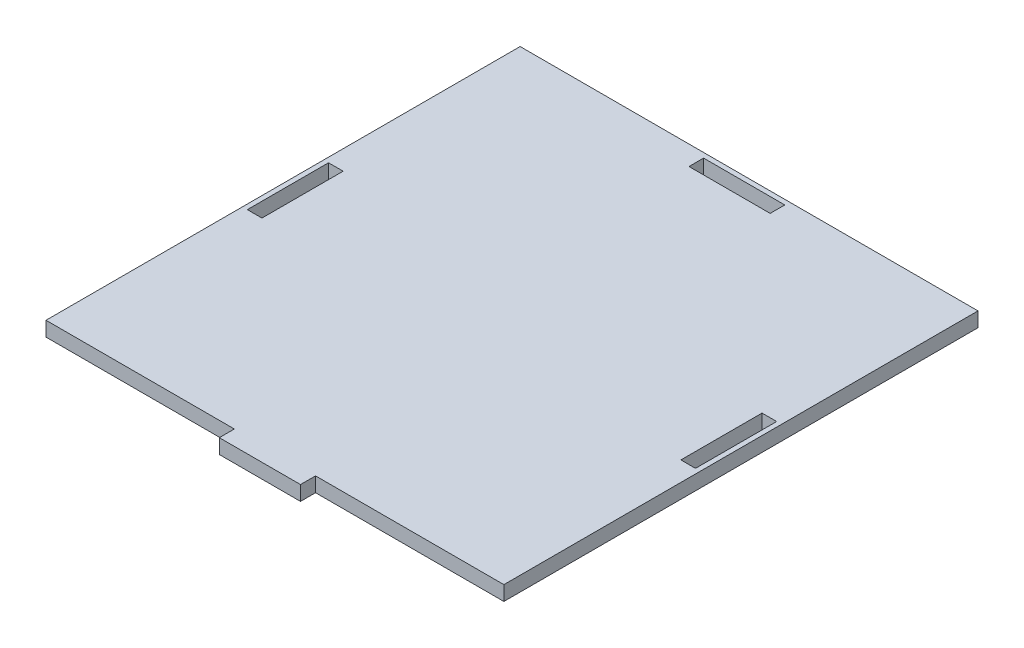
ISO-10303-21;
HEADER;
FILE_DESCRIPTION(('STEP AP214'),'2;1');
FILE_NAME('part.step','',(''),(''),'','','');
FILE_SCHEMA(('AUTOMOTIVE_DESIGN { 1 0 10303 214 1 1 1 1 }'));
ENDSEC;
DATA;
#1=APPLICATION_CONTEXT('core data for automotive mechanical design processes');
#2=APPLICATION_PROTOCOL_DEFINITION('international standard','automotive_design',2000,#1);
#3=PRODUCT_CONTEXT('',#1,'mechanical');
#4=PRODUCT('Part','Part','',(#3));
#5=PRODUCT_RELATED_PRODUCT_CATEGORY('part','',(#4));
#6=PRODUCT_DEFINITION_FORMATION('','',#4);
#7=PRODUCT_DEFINITION_CONTEXT('part definition',#1,'design');
#8=PRODUCT_DEFINITION('design','',#6,#7);
#9=PRODUCT_DEFINITION_SHAPE('','',#8);
#10=(LENGTH_UNIT() NAMED_UNIT(*) SI_UNIT(.MILLI.,.METRE.));
#11=(NAMED_UNIT(*) PLANE_ANGLE_UNIT() SI_UNIT($,.RADIAN.));
#12=(NAMED_UNIT(*) SI_UNIT($,.STERADIAN.) SOLID_ANGLE_UNIT());
#13=UNCERTAINTY_MEASURE_WITH_UNIT(LENGTH_MEASURE(1.E-05),#10,'distance_accuracy_value','');
#14=(GEOMETRIC_REPRESENTATION_CONTEXT(3) GLOBAL_UNCERTAINTY_ASSIGNED_CONTEXT((#13)) GLOBAL_UNIT_ASSIGNED_CONTEXT((#10,
#11,#12)) REPRESENTATION_CONTEXT('',''));
#15=CARTESIAN_POINT('',(0.,0.,0.));
#16=DIRECTION('',(0.,0.,1.));
#17=DIRECTION('',(1.,0.,0.));
#18=AXIS2_PLACEMENT_3D('',#15,#16,#17);
#19=CARTESIAN_POINT('',(0.,18.,0.));
#20=DIRECTION('',(0.,1.,0.));
#21=DIRECTION('',(0.,0.,1.));
#22=AXIS2_PLACEMENT_3D('',#19,#20,#21);
#23=PLANE('',#22);
#24=DIRECTION('',(1.,0.,0.));
#25=VECTOR('',#24,1.);
#26=CARTESIAN_POINT('',(-50.0000000000003,18.,-286.));
#27=LINE('',#26,#25);
#28=CARTESIAN_POINT('',(-50.0000000000003,18.,-286.));
#29=VERTEX_POINT('',#28);
#30=CARTESIAN_POINT('',(49.9999999999998,18.,-286.));
#31=VERTEX_POINT('',#30);
#32=EDGE_CURVE('E177',#29,#31,#27,.T.);
#33=ORIENTED_EDGE('',*,*,#32,.T.);
#34=DIRECTION('',(0.,0.,-1.));
#35=VECTOR('',#34,1.);
#36=CARTESIAN_POINT('',(49.9999999999998,18.,-268.));
#37=LINE('',#36,#35);
#38=CARTESIAN_POINT('',(49.9999999999998,18.,-268.));
#39=VERTEX_POINT('',#38);
#40=EDGE_CURVE('E169',#39,#31,#37,.T.);
#41=ORIENTED_EDGE('',*,*,#40,.F.);
#42=DIRECTION('',(1.,0.,0.));
#43=VECTOR('',#42,1.);
#44=CARTESIAN_POINT('',(-50.0000000000003,18.,-268.));
#45=LINE('',#44,#43);
#46=CARTESIAN_POINT('',(-50.0000000000003,18.,-268.));
#47=VERTEX_POINT('',#46);
#48=EDGE_CURVE('E176',#47,#39,#45,.T.);
#49=ORIENTED_EDGE('',*,*,#48,.F.);
#50=DIRECTION('',(0.,0.,-1.));
#51=VECTOR('',#50,1.);
#52=CARTESIAN_POINT('',(-50.0000000000003,18.,-268.));
#53=LINE('',#52,#51);
#54=EDGE_CURVE('E182',#47,#29,#53,.T.);
#55=ORIENTED_EDGE('',*,*,#54,.T.);
#56=EDGE_LOOP('',(#33,#41,#49,#55));
#57=FACE_BOUND('',#56,.T.);
#58=DIRECTION('',(-1.,0.,0.));
#59=VECTOR('',#58,1.);
#60=CARTESIAN_POINT('',(-258.,18.,50.));
#61=LINE('',#60,#59);
#62=CARTESIAN_POINT('',(-258.,18.,50.));
#63=VERTEX_POINT('',#62);
#64=CARTESIAN_POINT('',(-276.,18.,50.));
#65=VERTEX_POINT('',#64);
#66=EDGE_CURVE('E251',#63,#65,#61,.T.);
#67=ORIENTED_EDGE('',*,*,#66,.T.);
#68=DIRECTION('',(0.,0.,-1.));
#69=VECTOR('',#68,1.);
#70=CARTESIAN_POINT('',(-276.,18.,50.));
#71=LINE('',#70,#69);
#72=CARTESIAN_POINT('',(-276.,18.,-50.0000000000001));
#73=VERTEX_POINT('',#72);
#74=EDGE_CURVE('E262',#65,#73,#71,.T.);
#75=ORIENTED_EDGE('',*,*,#74,.T.);
#76=DIRECTION('',(-1.,0.,0.));
#77=VECTOR('',#76,1.);
#78=CARTESIAN_POINT('',(-258.,18.,-50.0000000000001));
#79=LINE('',#78,#77);
#80=CARTESIAN_POINT('',(-258.,18.,-50.0000000000001));
#81=VERTEX_POINT('',#80);
#82=EDGE_CURVE('E259',#81,#73,#79,.T.);
#83=ORIENTED_EDGE('',*,*,#82,.F.);
#84=DIRECTION('',(0.,0.,-1.));
#85=VECTOR('',#84,1.);
#86=CARTESIAN_POINT('',(-258.,18.,50.));
#87=LINE('',#86,#85);
#88=EDGE_CURVE('E241',#63,#81,#87,.T.);
#89=ORIENTED_EDGE('',*,*,#88,.F.);
#90=EDGE_LOOP('',(#67,#75,#83,#89));
#91=FACE_BOUND('',#90,.T.);
#92=DIRECTION('',(0.,0.,1.));
#93=VECTOR('',#92,1.);
#94=CARTESIAN_POINT('',(-282.,18.,-292.));
#95=LINE('',#94,#93);
#96=CARTESIAN_POINT('',(-282.,18.,-292.));
#97=VERTEX_POINT('',#96);
#98=CARTESIAN_POINT('',(-282.,18.,292.));
#99=VERTEX_POINT('',#98);
#100=EDGE_CURVE('E267',#97,#99,#95,.T.);
#101=ORIENTED_EDGE('',*,*,#100,.T.);
#102=DIRECTION('',(1.,0.,0.));
#103=VECTOR('',#102,1.);
#104=CARTESIAN_POINT('',(-282.,18.,292.));
#105=LINE('',#104,#103);
#106=CARTESIAN_POINT('',(-50.0000000000001,18.,292.));
#107=VERTEX_POINT('',#106);
#108=EDGE_CURVE('E270',#99,#107,#105,.T.);
#109=ORIENTED_EDGE('',*,*,#108,.T.);
#110=DIRECTION('',(0.,0.,1.));
#111=VECTOR('',#110,1.);
#112=CARTESIAN_POINT('',(-50.0000000000001,18.,292.));
#113=LINE('',#112,#111);
#114=CARTESIAN_POINT('',(-50.0000000000001,18.,310.51797990373));
#115=VERTEX_POINT('',#114);
#116=EDGE_CURVE('E273',#107,#115,#113,.T.);
#117=ORIENTED_EDGE('',*,*,#116,.T.);
#118=DIRECTION('',(1.,0.,0.));
#119=VECTOR('',#118,1.);
#120=CARTESIAN_POINT('',(-50.0000000000001,18.,310.51797990373));
#121=LINE('',#120,#119);
#122=CARTESIAN_POINT('',(49.9999999999999,18.,310.51797990373));
#123=VERTEX_POINT('',#122);
#124=EDGE_CURVE('E275',#115,#123,#121,.T.);
#125=ORIENTED_EDGE('',*,*,#124,.T.);
#126=DIRECTION('',(0.,0.,-1.));
#127=VECTOR('',#126,1.);
#128=CARTESIAN_POINT('',(49.9999999999999,18.,310.51797990373));
#129=LINE('',#128,#127);
#130=CARTESIAN_POINT('',(49.9999999999999,18.,292.));
#131=VERTEX_POINT('',#130);
#132=EDGE_CURVE('E277',#123,#131,#129,.T.);
#133=ORIENTED_EDGE('',*,*,#132,.T.);
#134=DIRECTION('',(1.,0.,0.));
#135=VECTOR('',#134,1.);
#136=CARTESIAN_POINT('',(49.9999999999999,18.,292.));
#137=LINE('',#136,#135);
#138=CARTESIAN_POINT('',(282.,18.,292.));
#139=VERTEX_POINT('',#138);
#140=EDGE_CURVE('E279',#131,#139,#137,.T.);
#141=ORIENTED_EDGE('',*,*,#140,.T.);
#142=DIRECTION('',(0.,0.,1.));
#143=VECTOR('',#142,1.);
#144=CARTESIAN_POINT('',(282.,18.,-292.));
#145=LINE('',#144,#143);
#146=CARTESIAN_POINT('',(282.,18.,-292.));
#147=VERTEX_POINT('',#146);
#148=EDGE_CURVE('E281',#147,#139,#145,.T.);
#149=ORIENTED_EDGE('',*,*,#148,.F.);
#150=DIRECTION('',(1.,0.,0.));
#151=VECTOR('',#150,1.);
#152=CARTESIAN_POINT('',(-282.,18.,-292.));
#153=LINE('',#152,#151);
#154=EDGE_CURVE('E284',#97,#147,#153,.T.);
#155=ORIENTED_EDGE('',*,*,#154,.F.);
#156=EDGE_LOOP('',(#101,#109,#117,#125,#133,#141,#149,#155));
#157=FACE_BOUND('',#156,.T.);
#158=DIRECTION('',(1.,0.,0.));
#159=VECTOR('',#158,1.);
#160=CARTESIAN_POINT('',(0.,18.,-50.0000000000001));
#161=LINE('',#160,#159);
#162=CARTESIAN_POINT('',(258.,18.,-50.0000000000001));
#163=VERTEX_POINT('',#162);
#164=CARTESIAN_POINT('',(276.,18.,-50.0000000000001));
#165=VERTEX_POINT('',#164);
#166=EDGE_CURVE('E213',#163,#165,#161,.T.);
#167=ORIENTED_EDGE('',*,*,#166,.T.);
#168=DIRECTION('',(0.,0.,-1.));
#169=VECTOR('',#168,1.);
#170=CARTESIAN_POINT('',(276.,18.,0.));
#171=LINE('',#170,#169);
#172=CARTESIAN_POINT('',(276.,18.,50.));
#173=VERTEX_POINT('',#172);
#174=EDGE_CURVE('E205',#173,#165,#171,.T.);
#175=ORIENTED_EDGE('',*,*,#174,.F.);
#176=DIRECTION('',(1.,0.,0.));
#177=VECTOR('',#176,1.);
#178=CARTESIAN_POINT('',(0.,18.,50.));
#179=LINE('',#178,#177);
#180=CARTESIAN_POINT('',(258.,18.,50.));
#181=VERTEX_POINT('',#180);
#182=EDGE_CURVE('E207',#181,#173,#179,.T.);
#183=ORIENTED_EDGE('',*,*,#182,.F.);
#184=DIRECTION('',(0.,0.,-1.));
#185=VECTOR('',#184,1.);
#186=CARTESIAN_POINT('',(258.,18.,0.));
#187=LINE('',#186,#185);
#188=EDGE_CURVE('E210',#181,#163,#187,.T.);
#189=ORIENTED_EDGE('',*,*,#188,.T.);
#190=EDGE_LOOP('',(#167,#175,#183,#189));
#191=FACE_BOUND('',#190,.T.);
#192=ADVANCED_FACE('F33',(#57,#91,#157,#191),#23,.T.);
#193=CARTESIAN_POINT('',(0.,0.,0.));
#194=DIRECTION('',(0.,1.,0.));
#195=DIRECTION('',(0.,0.,1.));
#196=AXIS2_PLACEMENT_3D('',#193,#194,#195);
#197=PLANE('',#196);
#198=DIRECTION('',(0.,0.,-1.));
#199=VECTOR('',#198,1.);
#200=CARTESIAN_POINT('',(49.9999999999998,0.,-268.));
#201=LINE('',#200,#199);
#202=CARTESIAN_POINT('',(49.9999999999998,0.,-268.));
#203=VERTEX_POINT('',#202);
#204=CARTESIAN_POINT('',(49.9999999999998,0.,-286.));
#205=VERTEX_POINT('',#204);
#206=EDGE_CURVE('E195',#203,#205,#201,.T.);
#207=ORIENTED_EDGE('',*,*,#206,.T.);
#208=DIRECTION('',(1.,0.,0.));
#209=VECTOR('',#208,1.);
#210=CARTESIAN_POINT('',(-50.0000000000003,0.,-286.));
#211=LINE('',#210,#209);
#212=CARTESIAN_POINT('',(-50.0000000000003,0.,-286.));
#213=VERTEX_POINT('',#212);
#214=EDGE_CURVE('E56',#213,#205,#211,.T.);
#215=ORIENTED_EDGE('',*,*,#214,.F.);
#216=DIRECTION('',(0.,0.,-1.));
#217=VECTOR('',#216,1.);
#218=CARTESIAN_POINT('',(-50.0000000000003,0.,-268.));
#219=LINE('',#218,#217);
#220=CARTESIAN_POINT('',(-50.0000000000003,0.,-268.));
#221=VERTEX_POINT('',#220);
#222=EDGE_CURVE('E186',#221,#213,#219,.T.);
#223=ORIENTED_EDGE('',*,*,#222,.F.);
#224=DIRECTION('',(1.,0.,0.));
#225=VECTOR('',#224,1.);
#226=CARTESIAN_POINT('',(-50.0000000000003,0.,-268.));
#227=LINE('',#226,#225);
#228=EDGE_CURVE('E189',#221,#203,#227,.T.);
#229=ORIENTED_EDGE('',*,*,#228,.T.);
#230=EDGE_LOOP('',(#207,#215,#223,#229));
#231=FACE_BOUND('',#230,.T.);
#232=DIRECTION('',(0.,0.,1.));
#233=VECTOR('',#232,1.);
#234=CARTESIAN_POINT('',(-282.,0.,-292.));
#235=LINE('',#234,#233);
#236=CARTESIAN_POINT('',(-282.,0.,-292.));
#237=VERTEX_POINT('',#236);
#238=CARTESIAN_POINT('',(-282.,0.,292.));
#239=VERTEX_POINT('',#238);
#240=EDGE_CURVE('E231',#237,#239,#235,.T.);
#241=ORIENTED_EDGE('',*,*,#240,.F.);
#242=DIRECTION('',(1.,0.,0.));
#243=VECTOR('',#242,1.);
#244=CARTESIAN_POINT('',(-282.,0.,-292.));
#245=LINE('',#244,#243);
#246=CARTESIAN_POINT('',(282.,0.,-292.));
#247=VERTEX_POINT('',#246);
#248=EDGE_CURVE('E271',#237,#247,#245,.T.);
#249=ORIENTED_EDGE('',*,*,#248,.T.);
#250=DIRECTION('',(0.,0.,1.));
#251=VECTOR('',#250,1.);
#252=CARTESIAN_POINT('',(282.,0.,-292.));
#253=LINE('',#252,#251);
#254=CARTESIAN_POINT('',(282.,0.,292.));
#255=VERTEX_POINT('',#254);
#256=EDGE_CURVE('E301',#247,#255,#253,.T.);
#257=ORIENTED_EDGE('',*,*,#256,.T.);
#258=DIRECTION('',(1.,0.,0.));
#259=VECTOR('',#258,1.);
#260=CARTESIAN_POINT('',(49.9999999999999,0.,292.));
#261=LINE('',#260,#259);
#262=CARTESIAN_POINT('',(49.9999999999999,0.,292.));
#263=VERTEX_POINT('',#262);
#264=EDGE_CURVE('E298',#263,#255,#261,.T.);
#265=ORIENTED_EDGE('',*,*,#264,.F.);
#266=DIRECTION('',(0.,0.,-1.));
#267=VECTOR('',#266,1.);
#268=CARTESIAN_POINT('',(49.9999999999999,0.,310.51797990373));
#269=LINE('',#268,#267);
#270=CARTESIAN_POINT('',(49.9999999999999,0.,310.51797990373));
#271=VERTEX_POINT('',#270);
#272=EDGE_CURVE('E296',#271,#263,#269,.T.);
#273=ORIENTED_EDGE('',*,*,#272,.F.);
#274=DIRECTION('',(1.,0.,0.));
#275=VECTOR('',#274,1.);
#276=CARTESIAN_POINT('',(-50.0000000000001,0.,310.51797990373));
#277=LINE('',#276,#275);
#278=CARTESIAN_POINT('',(-50.0000000000001,0.,310.51797990373));
#279=VERTEX_POINT('',#278);
#280=EDGE_CURVE('E294',#279,#271,#277,.T.);
#281=ORIENTED_EDGE('',*,*,#280,.F.);
#282=DIRECTION('',(0.,0.,1.));
#283=VECTOR('',#282,1.);
#284=CARTESIAN_POINT('',(-50.0000000000001,0.,292.));
#285=LINE('',#284,#283);
#286=CARTESIAN_POINT('',(-50.0000000000001,0.,292.));
#287=VERTEX_POINT('',#286);
#288=EDGE_CURVE('E292',#287,#279,#285,.T.);
#289=ORIENTED_EDGE('',*,*,#288,.F.);
#290=DIRECTION('',(1.,0.,0.));
#291=VECTOR('',#290,1.);
#292=CARTESIAN_POINT('',(-282.,0.,292.));
#293=LINE('',#292,#291);
#294=EDGE_CURVE('E290',#239,#287,#293,.T.);
#295=ORIENTED_EDGE('',*,*,#294,.F.);
#296=EDGE_LOOP('',(#241,#249,#257,#265,#273,#281,#289,#295));
#297=FACE_BOUND('',#296,.T.);
#298=DIRECTION('',(0.,0.,-1.));
#299=VECTOR('',#298,1.);
#300=CARTESIAN_POINT('',(-276.,0.,50.));
#301=LINE('',#300,#299);
#302=CARTESIAN_POINT('',(-276.,0.,50.));
#303=VERTEX_POINT('',#302);
#304=CARTESIAN_POINT('',(-276.,0.,-50.0000000000001));
#305=VERTEX_POINT('',#304);
#306=EDGE_CURVE('E254',#303,#305,#301,.T.);
#307=ORIENTED_EDGE('',*,*,#306,.F.);
#308=DIRECTION('',(-1.,0.,0.));
#309=VECTOR('',#308,1.);
#310=CARTESIAN_POINT('',(-258.,0.,50.));
#311=LINE('',#310,#309);
#312=CARTESIAN_POINT('',(-258.,0.,50.));
#313=VERTEX_POINT('',#312);
#314=EDGE_CURVE('E221',#313,#303,#311,.T.);
#315=ORIENTED_EDGE('',*,*,#314,.F.);
#316=DIRECTION('',(0.,0.,-1.));
#317=VECTOR('',#316,1.);
#318=CARTESIAN_POINT('',(-258.,0.,50.));
#319=LINE('',#318,#317);
#320=CARTESIAN_POINT('',(-258.,0.,-50.0000000000001));
#321=VERTEX_POINT('',#320);
#322=EDGE_CURVE('E247',#313,#321,#319,.T.);
#323=ORIENTED_EDGE('',*,*,#322,.T.);
#324=DIRECTION('',(-1.,0.,0.));
#325=VECTOR('',#324,1.);
#326=CARTESIAN_POINT('',(-258.,0.,-50.0000000000001));
#327=LINE('',#326,#325);
#328=EDGE_CURVE('E250',#321,#305,#327,.T.);
#329=ORIENTED_EDGE('',*,*,#328,.T.);
#330=EDGE_LOOP('',(#307,#315,#323,#329));
#331=FACE_BOUND('',#330,.T.);
#332=DIRECTION('',(0.,0.,-1.));
#333=VECTOR('',#332,1.);
#334=CARTESIAN_POINT('',(276.,0.,0.));
#335=LINE('',#334,#333);
#336=CARTESIAN_POINT('',(276.,0.,50.));
#337=VERTEX_POINT('',#336);
#338=CARTESIAN_POINT('',(276.,0.,-50.0000000000001));
#339=VERTEX_POINT('',#338);
#340=EDGE_CURVE('E217',#337,#339,#335,.T.);
#341=ORIENTED_EDGE('',*,*,#340,.T.);
#342=DIRECTION('',(1.,0.,0.));
#343=VECTOR('',#342,1.);
#344=CARTESIAN_POINT('',(0.,0.,-50.0000000000001));
#345=LINE('',#344,#343);
#346=CARTESIAN_POINT('',(258.,0.,-50.0000000000001));
#347=VERTEX_POINT('',#346);
#348=EDGE_CURVE('E208',#347,#339,#345,.T.);
#349=ORIENTED_EDGE('',*,*,#348,.F.);
#350=DIRECTION('',(0.,0.,-1.));
#351=VECTOR('',#350,1.);
#352=CARTESIAN_POINT('',(258.,0.,0.));
#353=LINE('',#352,#351);
#354=CARTESIAN_POINT('',(258.,0.,50.));
#355=VERTEX_POINT('',#354);
#356=EDGE_CURVE('E224',#355,#347,#353,.T.);
#357=ORIENTED_EDGE('',*,*,#356,.F.);
#358=DIRECTION('',(1.,0.,0.));
#359=VECTOR('',#358,1.);
#360=CARTESIAN_POINT('',(0.,0.,50.));
#361=LINE('',#360,#359);
#362=EDGE_CURVE('E220',#355,#337,#361,.T.);
#363=ORIENTED_EDGE('',*,*,#362,.T.);
#364=EDGE_LOOP('',(#341,#349,#357,#363));
#365=FACE_BOUND('',#364,.T.);
#366=ADVANCED_FACE('F330',(#231,#297,#331,#365),#197,.F.);
#367=CARTESIAN_POINT('',(-282.,18.,-292.));
#368=DIRECTION('',(1.,0.,0.));
#369=DIRECTION('',(0.,0.,-1.));
#370=AXIS2_PLACEMENT_3D('',#367,#368,#369);
#371=PLANE('',#370);
#372=ORIENTED_EDGE('',*,*,#240,.T.);
#373=DIRECTION('',(0.,-1.,0.));
#374=VECTOR('',#373,1.);
#375=CARTESIAN_POINT('',(-282.,18.,292.));
#376=LINE('',#375,#374);
#377=EDGE_CURVE('E11',#99,#239,#376,.T.);
#378=ORIENTED_EDGE('',*,*,#377,.F.);
#379=ORIENTED_EDGE('',*,*,#100,.F.);
#380=DIRECTION('',(0.,-1.,0.));
#381=VECTOR('',#380,1.);
#382=CARTESIAN_POINT('',(-282.,18.,-292.));
#383=LINE('',#382,#381);
#384=EDGE_CURVE('E287',#97,#237,#383,.T.);
#385=ORIENTED_EDGE('',*,*,#384,.T.);
#386=EDGE_LOOP('',(#372,#378,#379,#385));
#387=FACE_BOUND('',#386,.T.);
#388=ADVANCED_FACE('F35',(#387),#371,.F.);
#389=CARTESIAN_POINT('',(-282.,18.,292.));
#390=DIRECTION('',(0.,0.,-1.));
#391=DIRECTION('',(-1.,0.,0.));
#392=AXIS2_PLACEMENT_3D('',#389,#390,#391);
#393=PLANE('',#392);
#394=ORIENTED_EDGE('',*,*,#294,.T.);
#395=DIRECTION('',(0.,-1.,0.));
#396=VECTOR('',#395,1.);
#397=CARTESIAN_POINT('',(-50.0000000000001,18.,292.));
#398=LINE('',#397,#396);
#399=EDGE_CURVE('E41',#107,#287,#398,.T.);
#400=ORIENTED_EDGE('',*,*,#399,.F.);
#401=ORIENTED_EDGE('',*,*,#108,.F.);
#402=ORIENTED_EDGE('',*,*,#377,.T.);
#403=EDGE_LOOP('',(#394,#400,#401,#402));
#404=FACE_BOUND('',#403,.T.);
#405=ADVANCED_FACE('F350',(#404),#393,.F.);
#406=CARTESIAN_POINT('',(-50.0000000000001,18.,292.));
#407=DIRECTION('',(1.,0.,0.));
#408=DIRECTION('',(0.,0.,-1.));
#409=AXIS2_PLACEMENT_3D('',#406,#407,#408);
#410=PLANE('',#409);
#411=ORIENTED_EDGE('',*,*,#288,.T.);
#412=DIRECTION('',(0.,-1.,0.));
#413=VECTOR('',#412,1.);
#414=CARTESIAN_POINT('',(-50.0000000000001,18.,310.51797990373));
#415=LINE('',#414,#413);
#416=EDGE_CURVE('E317',#115,#279,#415,.T.);
#417=ORIENTED_EDGE('',*,*,#416,.F.);
#418=ORIENTED_EDGE('',*,*,#116,.F.);
#419=ORIENTED_EDGE('',*,*,#399,.T.);
#420=EDGE_LOOP('',(#411,#417,#418,#419));
#421=FACE_BOUND('',#420,.T.);
#422=ADVANCED_FACE('F324',(#421),#410,.F.);
#423=CARTESIAN_POINT('',(-50.0000000000001,18.,310.51797990373));
#424=DIRECTION('',(0.,0.,-1.));
#425=DIRECTION('',(-1.,0.,0.));
#426=AXIS2_PLACEMENT_3D('',#423,#424,#425);
#427=PLANE('',#426);
#428=ORIENTED_EDGE('',*,*,#280,.T.);
#429=DIRECTION('',(0.,-1.,0.));
#430=VECTOR('',#429,1.);
#431=CARTESIAN_POINT('',(49.9999999999999,18.,310.51797990373));
#432=LINE('',#431,#430);
#433=EDGE_CURVE('E314',#123,#271,#432,.T.);
#434=ORIENTED_EDGE('',*,*,#433,.F.);
#435=ORIENTED_EDGE('',*,*,#124,.F.);
#436=ORIENTED_EDGE('',*,*,#416,.T.);
#437=EDGE_LOOP('',(#428,#434,#435,#436));
#438=FACE_BOUND('',#437,.T.);
#439=ADVANCED_FACE('F336',(#438),#427,.F.);
#440=CARTESIAN_POINT('',(49.9999999999999,18.,310.51797990373));
#441=DIRECTION('',(-1.,0.,0.));
#442=DIRECTION('',(0.,0.,1.));
#443=AXIS2_PLACEMENT_3D('',#440,#441,#442);
#444=PLANE('',#443);
#445=ORIENTED_EDGE('',*,*,#272,.T.);
#446=DIRECTION('',(0.,-1.,0.));
#447=VECTOR('',#446,1.);
#448=CARTESIAN_POINT('',(49.9999999999999,18.,292.));
#449=LINE('',#448,#447);
#450=EDGE_CURVE('E311',#131,#263,#449,.T.);
#451=ORIENTED_EDGE('',*,*,#450,.F.);
#452=ORIENTED_EDGE('',*,*,#132,.F.);
#453=ORIENTED_EDGE('',*,*,#433,.T.);
#454=EDGE_LOOP('',(#445,#451,#452,#453));
#455=FACE_BOUND('',#454,.T.);
#456=ADVANCED_FACE('F340',(#455),#444,.F.);
#457=CARTESIAN_POINT('',(49.9999999999999,18.,292.));
#458=DIRECTION('',(0.,0.,-1.));
#459=DIRECTION('',(-1.,0.,0.));
#460=AXIS2_PLACEMENT_3D('',#457,#458,#459);
#461=PLANE('',#460);
#462=ORIENTED_EDGE('',*,*,#264,.T.);
#463=DIRECTION('',(0.,-1.,0.));
#464=VECTOR('',#463,1.);
#465=CARTESIAN_POINT('',(282.,18.,292.));
#466=LINE('',#465,#464);
#467=EDGE_CURVE('E309',#139,#255,#466,.T.);
#468=ORIENTED_EDGE('',*,*,#467,.F.);
#469=ORIENTED_EDGE('',*,*,#140,.F.);
#470=ORIENTED_EDGE('',*,*,#450,.T.);
#471=EDGE_LOOP('',(#462,#468,#469,#470));
#472=FACE_BOUND('',#471,.T.);
#473=ADVANCED_FACE('F359',(#472),#461,.F.);
#474=CARTESIAN_POINT('',(282.,18.,-292.));
#475=DIRECTION('',(1.,0.,0.));
#476=DIRECTION('',(0.,0.,-1.));
#477=AXIS2_PLACEMENT_3D('',#474,#475,#476);
#478=PLANE('',#477);
#479=ORIENTED_EDGE('',*,*,#256,.F.);
#480=DIRECTION('',(0.,-1.,0.));
#481=VECTOR('',#480,1.);
#482=CARTESIAN_POINT('',(282.,18.,-292.));
#483=LINE('',#482,#481);
#484=EDGE_CURVE('E307',#147,#247,#483,.T.);
#485=ORIENTED_EDGE('',*,*,#484,.F.);
#486=ORIENTED_EDGE('',*,*,#148,.T.);
#487=ORIENTED_EDGE('',*,*,#467,.T.);
#488=EDGE_LOOP('',(#479,#485,#486,#487));
#489=FACE_BOUND('',#488,.T.);
#490=ADVANCED_FACE('F357',(#489),#478,.T.);
#491=CARTESIAN_POINT('',(-282.,18.,-292.));
#492=DIRECTION('',(0.,0.,-1.));
#493=DIRECTION('',(-1.,0.,0.));
#494=AXIS2_PLACEMENT_3D('',#491,#492,#493);
#495=PLANE('',#494);
#496=ORIENTED_EDGE('',*,*,#248,.F.);
#497=ORIENTED_EDGE('',*,*,#384,.F.);
#498=ORIENTED_EDGE('',*,*,#154,.T.);
#499=ORIENTED_EDGE('',*,*,#484,.T.);
#500=EDGE_LOOP('',(#496,#497,#498,#499));
#501=FACE_BOUND('',#500,.T.);
#502=ADVANCED_FACE('F354',(#501),#495,.T.);
#503=CARTESIAN_POINT('',(-258.,18.,50.));
#504=DIRECTION('',(0.,0.,1.));
#505=DIRECTION('',(1.,0.,0.));
#506=AXIS2_PLACEMENT_3D('',#503,#504,#505);
#507=PLANE('',#506);
#508=ORIENTED_EDGE('',*,*,#314,.T.);
#509=DIRECTION('',(0.,-1.,0.));
#510=VECTOR('',#509,1.);
#511=CARTESIAN_POINT('',(-276.,18.,50.));
#512=LINE('',#511,#510);
#513=EDGE_CURVE('E238',#65,#303,#512,.T.);
#514=ORIENTED_EDGE('',*,*,#513,.F.);
#515=ORIENTED_EDGE('',*,*,#66,.F.);
#516=DIRECTION('',(0.,-1.,0.));
#517=VECTOR('',#516,1.);
#518=CARTESIAN_POINT('',(-258.,18.,50.));
#519=LINE('',#518,#517);
#520=EDGE_CURVE('E201',#63,#313,#519,.T.);
#521=ORIENTED_EDGE('',*,*,#520,.T.);
#522=EDGE_LOOP('',(#508,#514,#515,#521));
#523=FACE_BOUND('',#522,.T.);
#524=ADVANCED_FACE('F380',(#523),#507,.F.);
#525=CARTESIAN_POINT('',(-258.,18.,50.));
#526=DIRECTION('',(-1.,0.,0.));
#527=DIRECTION('',(0.,0.,1.));
#528=AXIS2_PLACEMENT_3D('',#525,#526,#527);
#529=PLANE('',#528);
#530=ORIENTED_EDGE('',*,*,#322,.F.);
#531=ORIENTED_EDGE('',*,*,#520,.F.);
#532=ORIENTED_EDGE('',*,*,#88,.T.);
#533=DIRECTION('',(0.,-1.,0.));
#534=VECTOR('',#533,1.);
#535=CARTESIAN_POINT('',(-258.,18.,-50.0000000000001));
#536=LINE('',#535,#534);
#537=EDGE_CURVE('E244',#81,#321,#536,.T.);
#538=ORIENTED_EDGE('',*,*,#537,.T.);
#539=EDGE_LOOP('',(#530,#531,#532,#538));
#540=FACE_BOUND('',#539,.T.);
#541=ADVANCED_FACE('F376',(#540),#529,.T.);
#542=CARTESIAN_POINT('',(-258.,18.,-50.0000000000001));
#543=DIRECTION('',(0.,0.,1.));
#544=DIRECTION('',(1.,0.,0.));
#545=AXIS2_PLACEMENT_3D('',#542,#543,#544);
#546=PLANE('',#545);
#547=ORIENTED_EDGE('',*,*,#328,.F.);
#548=ORIENTED_EDGE('',*,*,#537,.F.);
#549=ORIENTED_EDGE('',*,*,#82,.T.);
#550=DIRECTION('',(0.,-1.,0.));
#551=VECTOR('',#550,1.);
#552=CARTESIAN_POINT('',(-276.,18.,-50.0000000000001));
#553=LINE('',#552,#551);
#554=EDGE_CURVE('E242',#73,#305,#553,.T.);
#555=ORIENTED_EDGE('',*,*,#554,.T.);
#556=EDGE_LOOP('',(#547,#548,#549,#555));
#557=FACE_BOUND('',#556,.T.);
#558=ADVANCED_FACE('F389',(#557),#546,.T.);
#559=CARTESIAN_POINT('',(-276.,18.,50.));
#560=DIRECTION('',(-1.,0.,0.));
#561=DIRECTION('',(0.,0.,1.));
#562=AXIS2_PLACEMENT_3D('',#559,#560,#561);
#563=PLANE('',#562);
#564=ORIENTED_EDGE('',*,*,#306,.T.);
#565=ORIENTED_EDGE('',*,*,#554,.F.);
#566=ORIENTED_EDGE('',*,*,#74,.F.);
#567=ORIENTED_EDGE('',*,*,#513,.T.);
#568=EDGE_LOOP('',(#564,#565,#566,#567));
#569=FACE_BOUND('',#568,.T.);
#570=ADVANCED_FACE('F395',(#569),#563,.F.);
#571=CARTESIAN_POINT('',(276.,18.,0.));
#572=DIRECTION('',(-1.,0.,0.));
#573=DIRECTION('',(0.,0.,1.));
#574=AXIS2_PLACEMENT_3D('',#571,#572,#573);
#575=PLANE('',#574);
#576=ORIENTED_EDGE('',*,*,#340,.F.);
#577=DIRECTION('',(0.,-1.,0.));
#578=VECTOR('',#577,1.);
#579=CARTESIAN_POINT('',(276.,18.,50.));
#580=LINE('',#579,#578);
#581=EDGE_CURVE('E216',#173,#337,#580,.T.);
#582=ORIENTED_EDGE('',*,*,#581,.F.);
#583=ORIENTED_EDGE('',*,*,#174,.T.);
#584=DIRECTION('',(0.,-1.,0.));
#585=VECTOR('',#584,1.);
#586=CARTESIAN_POINT('',(276.,18.,-50.0000000000001));
#587=LINE('',#586,#585);
#588=EDGE_CURVE('E229',#165,#339,#587,.T.);
#589=ORIENTED_EDGE('',*,*,#588,.T.);
#590=EDGE_LOOP('',(#576,#582,#583,#589));
#591=FACE_BOUND('',#590,.T.);
#592=ADVANCED_FACE('F393',(#591),#575,.T.);
#593=CARTESIAN_POINT('',(0.,18.,-50.0000000000001));
#594=DIRECTION('',(0.,0.,-1.));
#595=DIRECTION('',(-1.,0.,0.));
#596=AXIS2_PLACEMENT_3D('',#593,#594,#595);
#597=PLANE('',#596);
#598=ORIENTED_EDGE('',*,*,#348,.T.);
#599=ORIENTED_EDGE('',*,*,#588,.F.);
#600=ORIENTED_EDGE('',*,*,#166,.F.);
#601=DIRECTION('',(0.,-1.,0.));
#602=VECTOR('',#601,1.);
#603=CARTESIAN_POINT('',(258.,18.,-50.0000000000001));
#604=LINE('',#603,#602);
#605=EDGE_CURVE('E232',#163,#347,#604,.T.);
#606=ORIENTED_EDGE('',*,*,#605,.T.);
#607=EDGE_LOOP('',(#598,#599,#600,#606));
#608=FACE_BOUND('',#607,.T.);
#609=ADVANCED_FACE('F425',(#608),#597,.F.);
#610=CARTESIAN_POINT('',(258.,18.,0.));
#611=DIRECTION('',(-1.,0.,0.));
#612=DIRECTION('',(0.,0.,1.));
#613=AXIS2_PLACEMENT_3D('',#610,#611,#612);
#614=PLANE('',#613);
#615=ORIENTED_EDGE('',*,*,#356,.T.);
#616=ORIENTED_EDGE('',*,*,#605,.F.);
#617=ORIENTED_EDGE('',*,*,#188,.F.);
#618=DIRECTION('',(0.,-1.,0.));
#619=VECTOR('',#618,1.);
#620=CARTESIAN_POINT('',(258.,18.,50.));
#621=LINE('',#620,#619);
#622=EDGE_CURVE('E234',#181,#355,#621,.T.);
#623=ORIENTED_EDGE('',*,*,#622,.T.);
#624=EDGE_LOOP('',(#615,#616,#617,#623));
#625=FACE_BOUND('',#624,.T.);
#626=ADVANCED_FACE('F427',(#625),#614,.F.);
#627=CARTESIAN_POINT('',(0.,18.,50.));
#628=DIRECTION('',(0.,0.,-1.));
#629=DIRECTION('',(-1.,0.,0.));
#630=AXIS2_PLACEMENT_3D('',#627,#628,#629);
#631=PLANE('',#630);
#632=ORIENTED_EDGE('',*,*,#362,.F.);
#633=ORIENTED_EDGE('',*,*,#622,.F.);
#634=ORIENTED_EDGE('',*,*,#182,.T.);
#635=ORIENTED_EDGE('',*,*,#581,.T.);
#636=EDGE_LOOP('',(#632,#633,#634,#635));
#637=FACE_BOUND('',#636,.T.);
#638=ADVANCED_FACE('F420',(#637),#631,.T.);
#639=CARTESIAN_POINT('',(-50.0000000000003,18.,-286.));
#640=DIRECTION('',(0.,0.,-1.));
#641=DIRECTION('',(-1.,0.,0.));
#642=AXIS2_PLACEMENT_3D('',#639,#640,#641);
#643=PLANE('',#642);
#644=ORIENTED_EDGE('',*,*,#214,.T.);
#645=DIRECTION('',(0.,-1.,0.));
#646=VECTOR('',#645,1.);
#647=CARTESIAN_POINT('',(49.9999999999998,18.,-286.));
#648=LINE('',#647,#646);
#649=EDGE_CURVE('E171',#31,#205,#648,.T.);
#650=ORIENTED_EDGE('',*,*,#649,.F.);
#651=ORIENTED_EDGE('',*,*,#32,.F.);
#652=DIRECTION('',(0.,-1.,0.));
#653=VECTOR('',#652,1.);
#654=CARTESIAN_POINT('',(-50.0000000000003,18.,-286.));
#655=LINE('',#654,#653);
#656=EDGE_CURVE('E199',#29,#213,#655,.T.);
#657=ORIENTED_EDGE('',*,*,#656,.T.);
#658=EDGE_LOOP('',(#644,#650,#651,#657));
#659=FACE_BOUND('',#658,.T.);
#660=ADVANCED_FACE('F180',(#659),#643,.F.);
#661=CARTESIAN_POINT('',(-50.0000000000003,18.,-268.));
#662=DIRECTION('',(-1.,0.,0.));
#663=DIRECTION('',(0.,0.,1.));
#664=AXIS2_PLACEMENT_3D('',#661,#662,#663);
#665=PLANE('',#664);
#666=ORIENTED_EDGE('',*,*,#222,.T.);
#667=ORIENTED_EDGE('',*,*,#656,.F.);
#668=ORIENTED_EDGE('',*,*,#54,.F.);
#669=DIRECTION('',(0.,-1.,0.));
#670=VECTOR('',#669,1.);
#671=CARTESIAN_POINT('',(-50.0000000000003,18.,-268.));
#672=LINE('',#671,#670);
#673=EDGE_CURVE('E202',#47,#221,#672,.T.);
#674=ORIENTED_EDGE('',*,*,#673,.T.);
#675=EDGE_LOOP('',(#666,#667,#668,#674));
#676=FACE_BOUND('',#675,.T.);
#677=ADVANCED_FACE('F438',(#676),#665,.F.);
#678=CARTESIAN_POINT('',(-50.0000000000003,18.,-268.));
#679=DIRECTION('',(0.,0.,-1.));
#680=DIRECTION('',(-1.,0.,0.));
#681=AXIS2_PLACEMENT_3D('',#678,#679,#680);
#682=PLANE('',#681);
#683=ORIENTED_EDGE('',*,*,#228,.F.);
#684=ORIENTED_EDGE('',*,*,#673,.F.);
#685=ORIENTED_EDGE('',*,*,#48,.T.);
#686=DIRECTION('',(0.,-1.,0.));
#687=VECTOR('',#686,1.);
#688=CARTESIAN_POINT('',(49.9999999999998,18.,-268.));
#689=LINE('',#688,#687);
#690=EDGE_CURVE('E48',#39,#203,#689,.T.);
#691=ORIENTED_EDGE('',*,*,#690,.T.);
#692=EDGE_LOOP('',(#683,#684,#685,#691));
#693=FACE_BOUND('',#692,.T.);
#694=ADVANCED_FACE('F441',(#693),#682,.T.);
#695=CARTESIAN_POINT('',(49.9999999999998,18.,-268.));
#696=DIRECTION('',(-1.,0.,0.));
#697=DIRECTION('',(0.,0.,1.));
#698=AXIS2_PLACEMENT_3D('',#695,#696,#697);
#699=PLANE('',#698);
#700=ORIENTED_EDGE('',*,*,#206,.F.);
#701=ORIENTED_EDGE('',*,*,#690,.F.);
#702=ORIENTED_EDGE('',*,*,#40,.T.);
#703=ORIENTED_EDGE('',*,*,#649,.T.);
#704=EDGE_LOOP('',(#700,#701,#702,#703));
#705=FACE_BOUND('',#704,.T.);
#706=ADVANCED_FACE('F170',(#705),#699,.T.);
#707=CLOSED_SHELL('',(#192,#366,#388,#405,#422,#439,#456,#473,#490,#502,#524,#541,#558,#570,
#592,#609,#626,#638,#660,#677,#694,#706));
#708=MANIFOLD_SOLID_BREP('B2',#707);
#709=ADVANCED_BREP_SHAPE_REPRESENTATION('',(#18,#708),#14);
#710=SHAPE_DEFINITION_REPRESENTATION(#9,#709);
ENDSEC;
END-ISO-10303-21;
